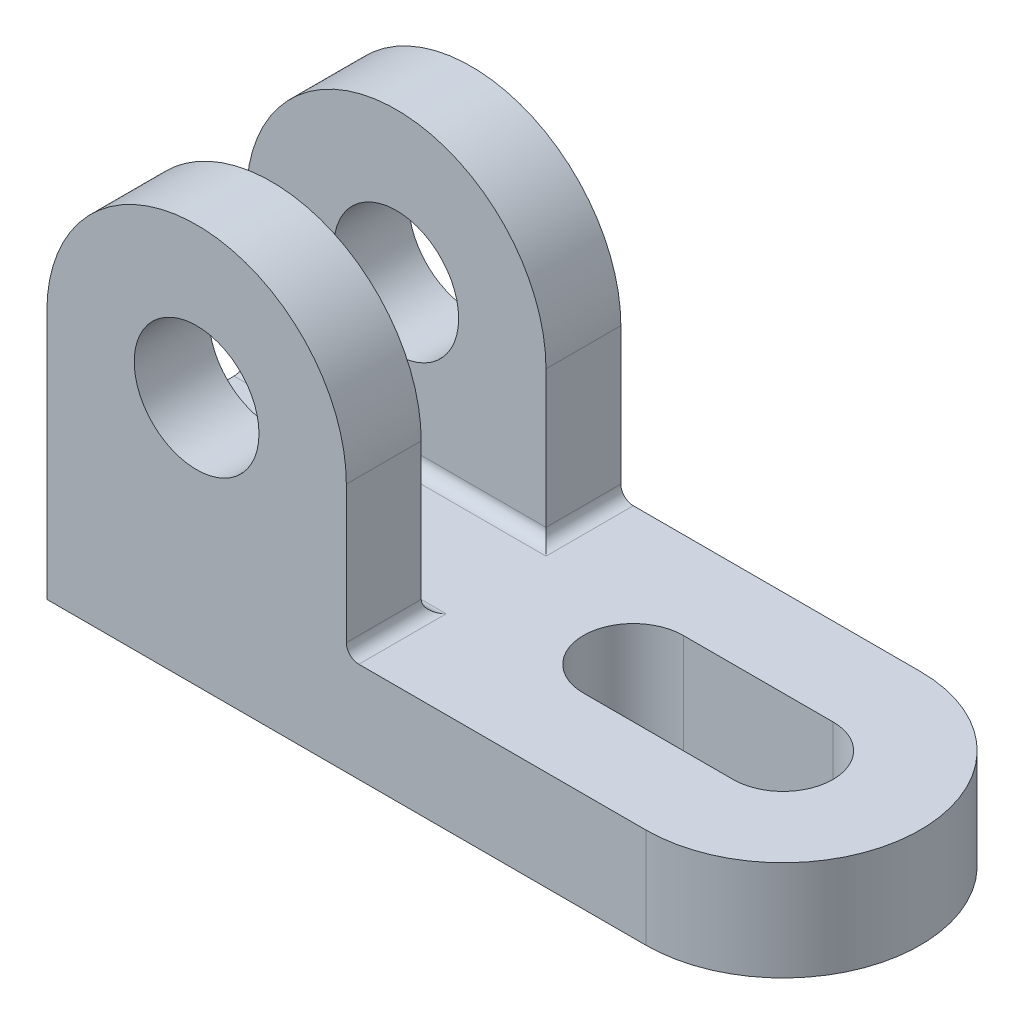
ISO-10303-21;
HEADER;
FILE_DESCRIPTION(('STEP AP214'),'2;1');
FILE_NAME('part.step','',(''),(''),'','','');
FILE_SCHEMA(('AUTOMOTIVE_DESIGN { 1 0 10303 214 1 1 1 1 }'));
ENDSEC;
DATA;
#1=APPLICATION_CONTEXT('core data for automotive mechanical design processes');
#2=APPLICATION_PROTOCOL_DEFINITION('international standard','automotive_design',2000,#1);
#3=PRODUCT_CONTEXT('',#1,'mechanical');
#4=PRODUCT('Part','Part','',(#3));
#5=PRODUCT_RELATED_PRODUCT_CATEGORY('part','',(#4));
#6=PRODUCT_DEFINITION_FORMATION('','',#4);
#7=PRODUCT_DEFINITION_CONTEXT('part definition',#1,'design');
#8=PRODUCT_DEFINITION('design','',#6,#7);
#9=PRODUCT_DEFINITION_SHAPE('','',#8);
#10=(LENGTH_UNIT() NAMED_UNIT(*) SI_UNIT(.MILLI.,.METRE.));
#11=(NAMED_UNIT(*) PLANE_ANGLE_UNIT() SI_UNIT($,.RADIAN.));
#12=(NAMED_UNIT(*) SI_UNIT($,.STERADIAN.) SOLID_ANGLE_UNIT());
#13=UNCERTAINTY_MEASURE_WITH_UNIT(LENGTH_MEASURE(1.E-05),#10,'distance_accuracy_value','');
#14=(GEOMETRIC_REPRESENTATION_CONTEXT(3) GLOBAL_UNCERTAINTY_ASSIGNED_CONTEXT((#13)) GLOBAL_UNIT_ASSIGNED_CONTEXT((#10,
#11,#12)) REPRESENTATION_CONTEXT('',''));
#15=CARTESIAN_POINT('',(0.,0.,0.));
#16=DIRECTION('',(0.,0.,1.));
#17=DIRECTION('',(1.,0.,0.));
#18=AXIS2_PLACEMENT_3D('',#15,#16,#17);
#19=CARTESIAN_POINT('',(37.,16.,0.));
#20=DIRECTION('',(0.,1.,0.));
#21=DIRECTION('',(0.,0.,1.));
#22=AXIS2_PLACEMENT_3D('',#19,#20,#21);
#23=PLANE('',#22);
#24=CARTESIAN_POINT('',(37.,16.,0.));
#25=DIRECTION('',(0.,1.,0.));
#26=DIRECTION('',(0.,0.,1.));
#27=AXIS2_PLACEMENT_3D('',#24,#25,#26);
#28=CIRCLE('',#27,8.);
#29=CARTESIAN_POINT('',(37.,16.,8.));
#30=VERTEX_POINT('',#29);
#31=CARTESIAN_POINT('',(37.,16.,-8.));
#32=VERTEX_POINT('',#31);
#33=EDGE_CURVE('E208',#30,#32,#28,.T.);
#34=ORIENTED_EDGE('',*,*,#33,.F.);
#35=DIRECTION('',(1.,0.,0.));
#36=VECTOR('',#35,1.);
#37=CARTESIAN_POINT('',(37.,16.,8.));
#38=LINE('',#37,#36);
#39=CARTESIAN_POINT('',(13.,16.,8.));
#40=VERTEX_POINT('',#39);
#41=EDGE_CURVE('E216',#40,#30,#38,.T.);
#42=ORIENTED_EDGE('',*,*,#41,.F.);
#43=CARTESIAN_POINT('',(13.,16.,0.));
#44=DIRECTION('',(0.,1.,0.));
#45=DIRECTION('',(0.,0.,1.));
#46=AXIS2_PLACEMENT_3D('',#43,#44,#45);
#47=CIRCLE('',#46,8.);
#48=CARTESIAN_POINT('',(13.,16.,-8.));
#49=VERTEX_POINT('',#48);
#50=EDGE_CURVE('E213',#49,#40,#47,.T.);
#51=ORIENTED_EDGE('',*,*,#50,.F.);
#52=DIRECTION('',(-1.,0.,0.));
#53=VECTOR('',#52,1.);
#54=CARTESIAN_POINT('',(37.,16.,-7.99999999999999));
#55=LINE('',#54,#53);
#56=EDGE_CURVE('E210',#32,#49,#55,.T.);
#57=ORIENTED_EDGE('',*,*,#56,.F.);
#58=EDGE_LOOP('',(#34,#42,#51,#57));
#59=FACE_BOUND('',#58,.T.);
#60=DIRECTION('',(0.,0.,1.));
#61=VECTOR('',#60,1.);
#62=CARTESIAN_POINT('',(-59.,16.,-22.));
#63=LINE('',#62,#61);
#64=CARTESIAN_POINT('',(-59.,16.,-8.));
#65=VERTEX_POINT('',#64);
#66=CARTESIAN_POINT('',(-59.,16.,8.));
#67=VERTEX_POINT('',#66);
#68=EDGE_CURVE('E232',#65,#67,#63,.T.);
#69=ORIENTED_EDGE('',*,*,#68,.T.);
#70=DIRECTION('',(1.,0.,0.));
#71=VECTOR('',#70,1.);
#72=CARTESIAN_POINT('',(37.,16.,8.));
#73=LINE('',#72,#71);
#74=CARTESIAN_POINT('',(-8.99999999999999,16.,8.));
#75=VERTEX_POINT('',#74);
#76=EDGE_CURVE('E267',#67,#75,#73,.T.);
#77=ORIENTED_EDGE('',*,*,#76,.T.);
#78=DIRECTION('',(0.,0.,-1.));
#79=VECTOR('',#78,1.);
#80=CARTESIAN_POINT('',(-8.99999999999999,16.,22.));
#81=LINE('',#80,#79);
#82=CARTESIAN_POINT('',(-8.99999999999999,16.,22.));
#83=VERTEX_POINT('',#82);
#84=EDGE_CURVE('E265',#75,#83,#81,.F.);
#85=ORIENTED_EDGE('',*,*,#84,.T.);
#86=DIRECTION('',(1.,0.,0.));
#87=VECTOR('',#86,1.);
#88=CARTESIAN_POINT('',(-59.,16.,22.));
#89=LINE('',#88,#87);
#90=CARTESIAN_POINT('',(37.,16.,22.));
#91=VERTEX_POINT('',#90);
#92=EDGE_CURVE('E235',#83,#91,#89,.T.);
#93=ORIENTED_EDGE('',*,*,#92,.T.);
#94=CARTESIAN_POINT('',(37.,16.,0.));
#95=DIRECTION('',(0.,1.,0.));
#96=DIRECTION('',(0.,0.,1.));
#97=AXIS2_PLACEMENT_3D('',#94,#95,#96);
#98=CIRCLE('',#97,22.);
#99=CARTESIAN_POINT('',(37.,16.,-22.));
#100=VERTEX_POINT('',#99);
#101=EDGE_CURVE('E238',#91,#100,#98,.T.);
#102=ORIENTED_EDGE('',*,*,#101,.T.);
#103=DIRECTION('',(-1.,0.,0.));
#104=VECTOR('',#103,1.);
#105=CARTESIAN_POINT('',(-59.,16.,-22.));
#106=LINE('',#105,#104);
#107=CARTESIAN_POINT('',(-8.99999999999999,16.,-22.));
#108=VERTEX_POINT('',#107);
#109=EDGE_CURVE('E240',#100,#108,#106,.T.);
#110=ORIENTED_EDGE('',*,*,#109,.T.);
#111=DIRECTION('',(0.,0.,1.));
#112=VECTOR('',#111,1.);
#113=CARTESIAN_POINT('',(-8.99999999999999,16.,0.));
#114=LINE('',#113,#112);
#115=CARTESIAN_POINT('',(-8.99999999999999,16.,-8.));
#116=VERTEX_POINT('',#115);
#117=EDGE_CURVE('E262',#108,#116,#114,.T.);
#118=ORIENTED_EDGE('',*,*,#117,.T.);
#119=DIRECTION('',(-1.,0.,0.));
#120=VECTOR('',#119,1.);
#121=CARTESIAN_POINT('',(37.,16.,-8.));
#122=LINE('',#121,#120);
#123=EDGE_CURVE('E260',#116,#65,#122,.T.);
#124=ORIENTED_EDGE('',*,*,#123,.T.);
#125=EDGE_LOOP('',(#69,#77,#85,#93,#102,#110,#118,#124));
#126=FACE_BOUND('',#125,.T.);
#127=ADVANCED_FACE('F33',(#59,#126),#23,.T.);
#128=CARTESIAN_POINT('',(-59.,16.,-22.));
#129=DIRECTION('',(1.,0.,0.));
#130=DIRECTION('',(0.,0.,-1.));
#131=AXIS2_PLACEMENT_3D('',#128,#129,#130);
#132=PLANE('',#131);
#133=DIRECTION('',(0.,0.,1.));
#134=VECTOR('',#133,1.);
#135=CARTESIAN_POINT('',(-59.,0.,-22.));
#136=LINE('',#135,#134);
#137=CARTESIAN_POINT('',(-59.,0.,-22.));
#138=VERTEX_POINT('',#137);
#139=CARTESIAN_POINT('',(-59.,0.,22.));
#140=VERTEX_POINT('',#139);
#141=EDGE_CURVE('E231',#138,#140,#136,.T.);
#142=ORIENTED_EDGE('',*,*,#141,.T.);
#143=DIRECTION('',(0.,-1.,0.));
#144=VECTOR('',#143,1.);
#145=CARTESIAN_POINT('',(-59.,16.,22.));
#146=LINE('',#145,#144);
#147=CARTESIAN_POINT('',(-59.,40.,22.));
#148=VERTEX_POINT('',#147);
#149=EDGE_CURVE('E257',#148,#140,#146,.T.);
#150=ORIENTED_EDGE('',*,*,#149,.F.);
#151=DIRECTION('',(0.,0.,1.));
#152=VECTOR('',#151,1.);
#153=CARTESIAN_POINT('',(-59.,40.,10.));
#154=LINE('',#153,#152);
#155=CARTESIAN_POINT('',(-59.,40.,10.));
#156=VERTEX_POINT('',#155);
#157=EDGE_CURVE('E195',#156,#148,#154,.T.);
#158=ORIENTED_EDGE('',*,*,#157,.F.);
#159=DIRECTION('',(0.,1.,0.));
#160=VECTOR('',#159,1.);
#161=CARTESIAN_POINT('',(-59.,0.,10.));
#162=LINE('',#161,#160);
#163=CARTESIAN_POINT('',(-59.,18.,10.));
#164=VERTEX_POINT('',#163);
#165=EDGE_CURVE('E186',#164,#156,#162,.T.);
#166=ORIENTED_EDGE('',*,*,#165,.F.);
#167=CARTESIAN_POINT('',(-59.,18.,8.));
#168=DIRECTION('',(1.,0.,0.));
#169=DIRECTION('',(0.,0.,-1.));
#170=AXIS2_PLACEMENT_3D('',#167,#168,#169);
#171=CIRCLE('',#170,2.);
#172=EDGE_CURVE('E277',#164,#67,#171,.T.);
#173=ORIENTED_EDGE('',*,*,#172,.T.);
#174=ORIENTED_EDGE('',*,*,#68,.F.);
#175=CARTESIAN_POINT('',(-59.,18.,-8.));
#176=DIRECTION('',(1.,0.,0.));
#177=DIRECTION('',(0.,0.,-1.));
#178=AXIS2_PLACEMENT_3D('',#175,#176,#177);
#179=CIRCLE('',#178,2.);
#180=CARTESIAN_POINT('',(-59.,18.,-10.));
#181=VERTEX_POINT('',#180);
#182=EDGE_CURVE('E11',#65,#181,#179,.T.);
#183=ORIENTED_EDGE('',*,*,#182,.T.);
#184=DIRECTION('',(0.,1.,0.));
#185=VECTOR('',#184,1.);
#186=CARTESIAN_POINT('',(-59.,0.,-10.));
#187=LINE('',#186,#185);
#188=CARTESIAN_POINT('',(-59.,40.,-10.));
#189=VERTEX_POINT('',#188);
#190=EDGE_CURVE('E151',#181,#189,#187,.T.);
#191=ORIENTED_EDGE('',*,*,#190,.T.);
#192=DIRECTION('',(0.,0.,-1.));
#193=VECTOR('',#192,1.);
#194=CARTESIAN_POINT('',(-59.,40.,-10.));
#195=LINE('',#194,#193);
#196=CARTESIAN_POINT('',(-59.,40.,-22.));
#197=VERTEX_POINT('',#196);
#198=EDGE_CURVE('E156',#189,#197,#195,.T.);
#199=ORIENTED_EDGE('',*,*,#198,.T.);
#200=DIRECTION('',(0.,-1.,0.));
#201=VECTOR('',#200,1.);
#202=CARTESIAN_POINT('',(-59.,16.,-22.));
#203=LINE('',#202,#201);
#204=EDGE_CURVE('E243',#197,#138,#203,.T.);
#205=ORIENTED_EDGE('',*,*,#204,.T.);
#206=EDGE_LOOP('',(#142,#150,#158,#166,#173,#174,#183,#191,#199,#205));
#207=FACE_BOUND('',#206,.T.);
#208=ADVANCED_FACE('F153',(#207),#132,.F.);
#209=CARTESIAN_POINT('',(-59.,16.,22.));
#210=DIRECTION('',(0.,0.,-1.));
#211=DIRECTION('',(-1.,0.,0.));
#212=AXIS2_PLACEMENT_3D('',#209,#210,#211);
#213=PLANE('',#212);
#214=ORIENTED_EDGE('',*,*,#92,.F.);
#215=CARTESIAN_POINT('',(-8.99999999999999,18.,22.));
#216=DIRECTION('',(0.,0.,-1.));
#217=DIRECTION('',(-1.,0.,0.));
#218=AXIS2_PLACEMENT_3D('',#215,#216,#217);
#219=CIRCLE('',#218,2.);
#220=CARTESIAN_POINT('',(-11.,18.,22.));
#221=VERTEX_POINT('',#220);
#222=EDGE_CURVE('E279',#83,#221,#219,.T.);
#223=ORIENTED_EDGE('',*,*,#222,.T.);
#224=DIRECTION('',(0.,1.,0.));
#225=VECTOR('',#224,1.);
#226=CARTESIAN_POINT('',(-11.,0.,22.));
#227=LINE('',#226,#225);
#228=CARTESIAN_POINT('',(-11.,40.,22.));
#229=VERTEX_POINT('',#228);
#230=EDGE_CURVE('E191',#221,#229,#227,.T.);
#231=ORIENTED_EDGE('',*,*,#230,.T.);
#232=CARTESIAN_POINT('',(-35.,40.,22.));
#233=DIRECTION('',(0.,0.,1.));
#234=DIRECTION('',(1.,0.,0.));
#235=AXIS2_PLACEMENT_3D('',#232,#233,#234);
#236=CIRCLE('',#235,24.);
#237=EDGE_CURVE('E181',#229,#148,#236,.T.);
#238=ORIENTED_EDGE('',*,*,#237,.T.);
#239=ORIENTED_EDGE('',*,*,#149,.T.);
#240=DIRECTION('',(1.,0.,0.));
#241=VECTOR('',#240,1.);
#242=CARTESIAN_POINT('',(-59.,0.,22.));
#243=LINE('',#242,#241);
#244=CARTESIAN_POINT('',(37.,0.,22.));
#245=VERTEX_POINT('',#244);
#246=EDGE_CURVE('E245',#140,#245,#243,.T.);
#247=ORIENTED_EDGE('',*,*,#246,.T.);
#248=DIRECTION('',(0.,-1.,0.));
#249=VECTOR('',#248,1.);
#250=CARTESIAN_POINT('',(37.,16.,22.));
#251=LINE('',#250,#249);
#252=EDGE_CURVE('E254',#91,#245,#251,.T.);
#253=ORIENTED_EDGE('',*,*,#252,.F.);
#254=EDGE_LOOP('',(#214,#223,#231,#238,#239,#247,#253));
#255=FACE_BOUND('',#254,.T.);
#256=CARTESIAN_POINT('',(-35.,40.,22.));
#257=DIRECTION('',(0.,0.,1.));
#258=DIRECTION('',(1.,0.,0.));
#259=AXIS2_PLACEMENT_3D('',#256,#257,#258);
#260=CIRCLE('',#259,10.);
#261=CARTESIAN_POINT('',(-25.,40.,22.));
#262=VERTEX_POINT('',#261);
#263=EDGE_CURVE('E173',#262,#262,#260,.T.);
#264=ORIENTED_EDGE('',*,*,#263,.F.);
#265=EDGE_LOOP('',(#264));
#266=FACE_BOUND('',#265,.T.);
#267=ADVANCED_FACE('F336',(#255,#266),#213,.F.);
#268=CARTESIAN_POINT('',(37.,16.,0.));
#269=DIRECTION('',(0.,-1.,0.));
#270=DIRECTION('',(0.,0.,-1.));
#271=AXIS2_PLACEMENT_3D('',#268,#269,#270);
#272=CYLINDRICAL_SURFACE('',#271,22.);
#273=CARTESIAN_POINT('',(37.,0.,0.));
#274=DIRECTION('',(0.,1.,0.));
#275=DIRECTION('',(0.,0.,1.));
#276=AXIS2_PLACEMENT_3D('',#273,#274,#275);
#277=CIRCLE('',#276,22.);
#278=CARTESIAN_POINT('',(37.,0.,-22.));
#279=VERTEX_POINT('',#278);
#280=EDGE_CURVE('E247',#245,#279,#277,.T.);
#281=ORIENTED_EDGE('',*,*,#280,.T.);
#282=DIRECTION('',(0.,-1.,0.));
#283=VECTOR('',#282,1.);
#284=CARTESIAN_POINT('',(37.,16.,-22.));
#285=LINE('',#284,#283);
#286=EDGE_CURVE('E251',#100,#279,#285,.T.);
#287=ORIENTED_EDGE('',*,*,#286,.F.);
#288=ORIENTED_EDGE('',*,*,#101,.F.);
#289=ORIENTED_EDGE('',*,*,#252,.T.);
#290=EDGE_LOOP('',(#281,#287,#288,#289));
#291=FACE_BOUND('',#290,.T.);
#292=ADVANCED_FACE('F349',(#291),#272,.T.);
#293=CARTESIAN_POINT('',(-59.,16.,-22.));
#294=DIRECTION('',(0.,0.,1.));
#295=DIRECTION('',(1.,0.,0.));
#296=AXIS2_PLACEMENT_3D('',#293,#294,#295);
#297=PLANE('',#296);
#298=ORIENTED_EDGE('',*,*,#204,.F.);
#299=CARTESIAN_POINT('',(-35.,40.,-22.));
#300=DIRECTION('',(0.,0.,1.));
#301=DIRECTION('',(1.,0.,0.));
#302=AXIS2_PLACEMENT_3D('',#299,#300,#301);
#303=CIRCLE('',#302,24.);
#304=CARTESIAN_POINT('',(-11.,40.,-22.));
#305=VERTEX_POINT('',#304);
#306=EDGE_CURVE('E170',#305,#197,#303,.T.);
#307=ORIENTED_EDGE('',*,*,#306,.F.);
#308=DIRECTION('',(0.,1.,0.));
#309=VECTOR('',#308,1.);
#310=CARTESIAN_POINT('',(-11.,0.,-22.));
#311=LINE('',#310,#309);
#312=CARTESIAN_POINT('',(-11.,18.,-22.));
#313=VERTEX_POINT('',#312);
#314=EDGE_CURVE('E289',#313,#305,#311,.T.);
#315=ORIENTED_EDGE('',*,*,#314,.F.);
#316=CARTESIAN_POINT('',(-8.99999999999999,18.,-22.));
#317=DIRECTION('',(0.,0.,1.));
#318=DIRECTION('',(1.,0.,0.));
#319=AXIS2_PLACEMENT_3D('',#316,#317,#318);
#320=CIRCLE('',#319,2.);
#321=EDGE_CURVE('E42',#313,#108,#320,.T.);
#322=ORIENTED_EDGE('',*,*,#321,.T.);
#323=ORIENTED_EDGE('',*,*,#109,.F.);
#324=ORIENTED_EDGE('',*,*,#286,.T.);
#325=DIRECTION('',(-1.,0.,0.));
#326=VECTOR('',#325,1.);
#327=CARTESIAN_POINT('',(-59.,0.,-22.));
#328=LINE('',#327,#326);
#329=EDGE_CURVE('E236',#279,#138,#328,.T.);
#330=ORIENTED_EDGE('',*,*,#329,.T.);
#331=EDGE_LOOP('',(#298,#307,#315,#322,#323,#324,#330));
#332=FACE_BOUND('',#331,.T.);
#333=CARTESIAN_POINT('',(-35.,40.,-22.));
#334=DIRECTION('',(0.,0.,1.));
#335=DIRECTION('',(1.,0.,0.));
#336=AXIS2_PLACEMENT_3D('',#333,#334,#335);
#337=CIRCLE('',#336,10.);
#338=CARTESIAN_POINT('',(-25.,40.,-22.));
#339=VERTEX_POINT('',#338);
#340=EDGE_CURVE('E282',#339,#339,#337,.T.);
#341=ORIENTED_EDGE('',*,*,#340,.T.);
#342=EDGE_LOOP('',(#341));
#343=FACE_BOUND('',#342,.T.);
#344=ADVANCED_FACE('F304',(#332,#343),#297,.F.);
#345=CARTESIAN_POINT('',(37.,0.,0.));
#346=DIRECTION('',(0.,1.,0.));
#347=DIRECTION('',(0.,0.,1.));
#348=AXIS2_PLACEMENT_3D('',#345,#346,#347);
#349=PLANE('',#348);
#350=ORIENTED_EDGE('',*,*,#141,.F.);
#351=ORIENTED_EDGE('',*,*,#329,.F.);
#352=ORIENTED_EDGE('',*,*,#280,.F.);
#353=ORIENTED_EDGE('',*,*,#246,.F.);
#354=EDGE_LOOP('',(#350,#351,#352,#353));
#355=FACE_BOUND('',#354,.T.);
#356=DIRECTION('',(-1.,0.,0.));
#357=VECTOR('',#356,1.);
#358=CARTESIAN_POINT('',(37.,0.,8.));
#359=LINE('',#358,#357);
#360=CARTESIAN_POINT('',(37.,0.,8.));
#361=VERTEX_POINT('',#360);
#362=CARTESIAN_POINT('',(13.,0.,8.));
#363=VERTEX_POINT('',#362);
#364=EDGE_CURVE('E202',#361,#363,#359,.T.);
#365=ORIENTED_EDGE('',*,*,#364,.F.);
#366=CARTESIAN_POINT('',(37.,0.,0.));
#367=DIRECTION('',(0.,1.,0.));
#368=DIRECTION('',(0.,0.,1.));
#369=AXIS2_PLACEMENT_3D('',#366,#367,#368);
#370=CIRCLE('',#369,8.);
#371=CARTESIAN_POINT('',(37.,0.,-7.99999999999999));
#372=VERTEX_POINT('',#371);
#373=EDGE_CURVE('E205',#372,#361,#370,.F.);
#374=ORIENTED_EDGE('',*,*,#373,.F.);
#375=DIRECTION('',(1.,0.,0.));
#376=VECTOR('',#375,1.);
#377=CARTESIAN_POINT('',(37.,0.,-7.99999999999999));
#378=LINE('',#377,#376);
#379=CARTESIAN_POINT('',(13.,0.,-8.));
#380=VERTEX_POINT('',#379);
#381=EDGE_CURVE('E222',#380,#372,#378,.T.);
#382=ORIENTED_EDGE('',*,*,#381,.F.);
#383=CARTESIAN_POINT('',(13.,0.,0.));
#384=DIRECTION('',(0.,1.,0.));
#385=DIRECTION('',(0.,0.,1.));
#386=AXIS2_PLACEMENT_3D('',#383,#384,#385);
#387=CIRCLE('',#386,8.);
#388=EDGE_CURVE('E198',#363,#380,#387,.F.);
#389=ORIENTED_EDGE('',*,*,#388,.F.);
#390=EDGE_LOOP('',(#365,#374,#382,#389));
#391=FACE_BOUND('',#390,.T.);
#392=ADVANCED_FACE('F343',(#355,#391),#349,.F.);
#393=CARTESIAN_POINT('',(37.,-0.001000000000001,0.));
#394=DIRECTION('',(0.,1.,0.));
#395=DIRECTION('',(0.,0.,1.));
#396=AXIS2_PLACEMENT_3D('',#393,#394,#395);
#397=CYLINDRICAL_SURFACE('',#396,8.);
#398=ORIENTED_EDGE('',*,*,#373,.T.);
#399=DIRECTION('',(0.,1.,0.));
#400=VECTOR('',#399,1.);
#401=CARTESIAN_POINT('',(37.,-0.001000000000001,8.));
#402=LINE('',#401,#400);
#403=EDGE_CURVE('E220',#361,#30,#402,.T.);
#404=ORIENTED_EDGE('',*,*,#403,.T.);
#405=ORIENTED_EDGE('',*,*,#33,.T.);
#406=DIRECTION('',(0.,1.,0.));
#407=VECTOR('',#406,1.);
#408=CARTESIAN_POINT('',(37.,-0.001000000000001,-7.99999999999999));
#409=LINE('',#408,#407);
#410=EDGE_CURVE('E219',#372,#32,#409,.T.);
#411=ORIENTED_EDGE('',*,*,#410,.F.);
#412=EDGE_LOOP('',(#398,#404,#405,#411));
#413=FACE_BOUND('',#412,.T.);
#414=ADVANCED_FACE('F341',(#413),#397,.F.);
#415=CARTESIAN_POINT('',(37.,-0.001000000000001,8.));
#416=DIRECTION('',(0.,0.,1.));
#417=DIRECTION('',(1.,0.,0.));
#418=AXIS2_PLACEMENT_3D('',#415,#416,#417);
#419=PLANE('',#418);
#420=ORIENTED_EDGE('',*,*,#364,.T.);
#421=DIRECTION('',(0.,1.,0.));
#422=VECTOR('',#421,1.);
#423=CARTESIAN_POINT('',(13.,-0.001000000000001,8.));
#424=LINE('',#423,#422);
#425=EDGE_CURVE('E223',#363,#40,#424,.T.);
#426=ORIENTED_EDGE('',*,*,#425,.T.);
#427=ORIENTED_EDGE('',*,*,#41,.T.);
#428=ORIENTED_EDGE('',*,*,#403,.F.);
#429=EDGE_LOOP('',(#420,#426,#427,#428));
#430=FACE_BOUND('',#429,.T.);
#431=ADVANCED_FACE('F496',(#430),#419,.F.);
#432=CARTESIAN_POINT('',(13.,-0.001000000000001,0.));
#433=DIRECTION('',(0.,1.,0.));
#434=DIRECTION('',(0.,0.,1.));
#435=AXIS2_PLACEMENT_3D('',#432,#433,#434);
#436=CYLINDRICAL_SURFACE('',#435,8.);
#437=ORIENTED_EDGE('',*,*,#388,.T.);
#438=DIRECTION('',(0.,1.,0.));
#439=VECTOR('',#438,1.);
#440=CARTESIAN_POINT('',(13.,-0.001000000000001,-8.));
#441=LINE('',#440,#439);
#442=EDGE_CURVE('E225',#380,#49,#441,.T.);
#443=ORIENTED_EDGE('',*,*,#442,.T.);
#444=ORIENTED_EDGE('',*,*,#50,.T.);
#445=ORIENTED_EDGE('',*,*,#425,.F.);
#446=EDGE_LOOP('',(#437,#443,#444,#445));
#447=FACE_BOUND('',#446,.T.);
#448=ADVANCED_FACE('F486',(#447),#436,.F.);
#449=CARTESIAN_POINT('',(37.,-0.001000000000001,-7.99999999999999));
#450=DIRECTION('',(0.,0.,-1.));
#451=DIRECTION('',(-1.,0.,0.));
#452=AXIS2_PLACEMENT_3D('',#449,#450,#451);
#453=PLANE('',#452);
#454=ORIENTED_EDGE('',*,*,#381,.T.);
#455=ORIENTED_EDGE('',*,*,#410,.T.);
#456=ORIENTED_EDGE('',*,*,#56,.T.);
#457=ORIENTED_EDGE('',*,*,#442,.F.);
#458=EDGE_LOOP('',(#454,#455,#456,#457));
#459=FACE_BOUND('',#458,.T.);
#460=ADVANCED_FACE('F413',(#459),#453,.F.);
#461=CARTESIAN_POINT('',(-11.,0.,10.));
#462=DIRECTION('',(1.,0.,0.));
#463=DIRECTION('',(0.,0.,-1.));
#464=AXIS2_PLACEMENT_3D('',#461,#462,#463);
#465=PLANE('',#464);
#466=ORIENTED_EDGE('',*,*,#230,.F.);
#467=DIRECTION('',(0.,0.,-1.));
#468=VECTOR('',#467,1.);
#469=CARTESIAN_POINT('',(-11.,18.,10.));
#470=LINE('',#469,#468);
#471=CARTESIAN_POINT('',(-11.,18.,10.));
#472=VERTEX_POINT('',#471);
#473=EDGE_CURVE('E272',#221,#472,#470,.T.);
#474=ORIENTED_EDGE('',*,*,#473,.T.);
#475=DIRECTION('',(0.,1.,0.));
#476=VECTOR('',#475,1.);
#477=CARTESIAN_POINT('',(-11.,0.,10.));
#478=LINE('',#477,#476);
#479=CARTESIAN_POINT('',(-11.,40.,10.));
#480=VERTEX_POINT('',#479);
#481=EDGE_CURVE('E180',#472,#480,#478,.T.);
#482=ORIENTED_EDGE('',*,*,#481,.T.);
#483=DIRECTION('',(0.,0.,1.));
#484=VECTOR('',#483,1.);
#485=CARTESIAN_POINT('',(-11.,40.,10.));
#486=LINE('',#485,#484);
#487=EDGE_CURVE('E188',#480,#229,#486,.T.);
#488=ORIENTED_EDGE('',*,*,#487,.T.);
#489=EDGE_LOOP('',(#466,#474,#482,#488));
#490=FACE_BOUND('',#489,.T.);
#491=ADVANCED_FACE('F407',(#490),#465,.T.);
#492=CARTESIAN_POINT('',(-35.,40.,10.));
#493=DIRECTION('',(0.,0.,1.));
#494=DIRECTION('',(1.,0.,0.));
#495=AXIS2_PLACEMENT_3D('',#492,#493,#494);
#496=CYLINDRICAL_SURFACE('',#495,10.);
#497=CARTESIAN_POINT('',(-35.,40.,10.));
#498=DIRECTION('',(0.,0.,1.));
#499=DIRECTION('',(1.,0.,0.));
#500=AXIS2_PLACEMENT_3D('',#497,#498,#499);
#501=CIRCLE('',#500,10.);
#502=CARTESIAN_POINT('',(-25.,40.,10.));
#503=VERTEX_POINT('',#502);
#504=EDGE_CURVE('E177',#503,#503,#501,.T.);
#505=ORIENTED_EDGE('',*,*,#504,.F.);
#506=EDGE_LOOP('',(#505));
#507=FACE_BOUND('',#506,.T.);
#508=ORIENTED_EDGE('',*,*,#263,.T.);
#509=EDGE_LOOP('',(#508));
#510=FACE_BOUND('',#509,.T.);
#511=ADVANCED_FACE('F412',(#507,#510),#496,.F.);
#512=CARTESIAN_POINT('',(-35.,40.,10.));
#513=DIRECTION('',(0.,0.,1.));
#514=DIRECTION('',(1.,0.,0.));
#515=AXIS2_PLACEMENT_3D('',#512,#513,#514);
#516=CYLINDRICAL_SURFACE('',#515,24.);
#517=ORIENTED_EDGE('',*,*,#237,.F.);
#518=ORIENTED_EDGE('',*,*,#487,.F.);
#519=CARTESIAN_POINT('',(-35.,40.,10.));
#520=DIRECTION('',(0.,0.,1.));
#521=DIRECTION('',(1.,0.,0.));
#522=AXIS2_PLACEMENT_3D('',#519,#520,#521);
#523=CIRCLE('',#522,24.);
#524=EDGE_CURVE('E183',#480,#156,#523,.T.);
#525=ORIENTED_EDGE('',*,*,#524,.T.);
#526=ORIENTED_EDGE('',*,*,#157,.T.);
#527=EDGE_LOOP('',(#517,#518,#525,#526));
#528=FACE_BOUND('',#527,.T.);
#529=ADVANCED_FACE('F398',(#528),#516,.T.);
#530=CARTESIAN_POINT('',(0.,0.,10.));
#531=DIRECTION('',(0.,0.,1.));
#532=DIRECTION('',(1.,0.,0.));
#533=AXIS2_PLACEMENT_3D('',#530,#531,#532);
#534=PLANE('',#533);
#535=ORIENTED_EDGE('',*,*,#481,.F.);
#536=DIRECTION('',(1.,0.,0.));
#537=VECTOR('',#536,1.);
#538=CARTESIAN_POINT('',(0.,18.,10.));
#539=LINE('',#538,#537);
#540=EDGE_CURVE('E270',#472,#164,#539,.F.);
#541=ORIENTED_EDGE('',*,*,#540,.T.);
#542=ORIENTED_EDGE('',*,*,#165,.T.);
#543=ORIENTED_EDGE('',*,*,#524,.F.);
#544=EDGE_LOOP('',(#535,#541,#542,#543));
#545=FACE_BOUND('',#544,.T.);
#546=ORIENTED_EDGE('',*,*,#504,.T.);
#547=EDGE_LOOP('',(#546));
#548=FACE_BOUND('',#547,.T.);
#549=ADVANCED_FACE('F386',(#545,#548),#534,.F.);
#550=CARTESIAN_POINT('',(-11.,0.,-10.));
#551=DIRECTION('',(-1.,0.,0.));
#552=DIRECTION('',(0.,0.,1.));
#553=AXIS2_PLACEMENT_3D('',#550,#551,#552);
#554=PLANE('',#553);
#555=DIRECTION('',(0.,1.,0.));
#556=VECTOR('',#555,1.);
#557=CARTESIAN_POINT('',(-11.,0.,-10.));
#558=LINE('',#557,#556);
#559=CARTESIAN_POINT('',(-11.,18.,-10.));
#560=VERTEX_POINT('',#559);
#561=CARTESIAN_POINT('',(-11.,40.,-10.));
#562=VERTEX_POINT('',#561);
#563=EDGE_CURVE('E159',#560,#562,#558,.T.);
#564=ORIENTED_EDGE('',*,*,#563,.F.);
#565=DIRECTION('',(0.,0.,1.));
#566=VECTOR('',#565,1.);
#567=CARTESIAN_POINT('',(-11.,18.,-10.));
#568=LINE('',#567,#566);
#569=EDGE_CURVE('E274',#560,#313,#568,.F.);
#570=ORIENTED_EDGE('',*,*,#569,.T.);
#571=ORIENTED_EDGE('',*,*,#314,.T.);
#572=DIRECTION('',(0.,0.,-1.));
#573=VECTOR('',#572,1.);
#574=CARTESIAN_POINT('',(-11.,40.,-10.));
#575=LINE('',#574,#573);
#576=EDGE_CURVE('E171',#562,#305,#575,.T.);
#577=ORIENTED_EDGE('',*,*,#576,.F.);
#578=EDGE_LOOP('',(#564,#570,#571,#577));
#579=FACE_BOUND('',#578,.T.);
#580=ADVANCED_FACE('F381',(#579),#554,.F.);
#581=CARTESIAN_POINT('',(-35.,40.,-10.));
#582=DIRECTION('',(0.,0.,-1.));
#583=DIRECTION('',(-1.,0.,0.));
#584=AXIS2_PLACEMENT_3D('',#581,#582,#583);
#585=CYLINDRICAL_SURFACE('',#584,24.);
#586=ORIENTED_EDGE('',*,*,#306,.T.);
#587=ORIENTED_EDGE('',*,*,#198,.F.);
#588=CARTESIAN_POINT('',(-35.,40.,-10.));
#589=DIRECTION('',(0.,0.,1.));
#590=DIRECTION('',(1.,0.,0.));
#591=AXIS2_PLACEMENT_3D('',#588,#589,#590);
#592=CIRCLE('',#591,24.);
#593=EDGE_CURVE('E158',#562,#189,#592,.T.);
#594=ORIENTED_EDGE('',*,*,#593,.F.);
#595=ORIENTED_EDGE('',*,*,#576,.T.);
#596=EDGE_LOOP('',(#586,#587,#594,#595));
#597=FACE_BOUND('',#596,.T.);
#598=ADVANCED_FACE('F168',(#597),#585,.T.);
#599=CARTESIAN_POINT('',(-35.,40.,-10.));
#600=DIRECTION('',(0.,0.,-1.));
#601=DIRECTION('',(-1.,0.,0.));
#602=AXIS2_PLACEMENT_3D('',#599,#600,#601);
#603=CYLINDRICAL_SURFACE('',#602,10.);
#604=CARTESIAN_POINT('',(-35.,40.,-10.));
#605=DIRECTION('',(0.,0.,1.));
#606=DIRECTION('',(1.,0.,0.));
#607=AXIS2_PLACEMENT_3D('',#604,#605,#606);
#608=CIRCLE('',#607,10.);
#609=CARTESIAN_POINT('',(-25.,40.,-10.));
#610=VERTEX_POINT('',#609);
#611=EDGE_CURVE('E310',#610,#610,#608,.T.);
#612=ORIENTED_EDGE('',*,*,#611,.T.);
#613=EDGE_LOOP('',(#612));
#614=FACE_BOUND('',#613,.T.);
#615=ORIENTED_EDGE('',*,*,#340,.F.);
#616=EDGE_LOOP('',(#615));
#617=FACE_BOUND('',#616,.T.);
#618=ADVANCED_FACE('F316',(#614,#617),#603,.F.);
#619=CARTESIAN_POINT('',(0.,0.,-10.));
#620=DIRECTION('',(0.,0.,-1.));
#621=DIRECTION('',(1.,0.,0.));
#622=AXIS2_PLACEMENT_3D('',#619,#620,#621);
#623=PLANE('',#622);
#624=ORIENTED_EDGE('',*,*,#190,.F.);
#625=DIRECTION('',(-1.,0.,0.));
#626=VECTOR('',#625,1.);
#627=CARTESIAN_POINT('',(0.,18.,-10.));
#628=LINE('',#627,#626);
#629=EDGE_CURVE('E55',#181,#560,#628,.F.);
#630=ORIENTED_EDGE('',*,*,#629,.T.);
#631=ORIENTED_EDGE('',*,*,#563,.T.);
#632=ORIENTED_EDGE('',*,*,#593,.T.);
#633=EDGE_LOOP('',(#624,#630,#631,#632));
#634=FACE_BOUND('',#633,.T.);
#635=ORIENTED_EDGE('',*,*,#611,.F.);
#636=EDGE_LOOP('',(#635));
#637=FACE_BOUND('',#636,.T.);
#638=ADVANCED_FACE('F162',(#634,#637),#623,.F.);
#639=CARTESIAN_POINT('',(-8.99999999999999,18.,10.));
#640=DIRECTION('',(0.,0.,1.));
#641=DIRECTION('',(1.,0.,0.));
#642=AXIS2_PLACEMENT_3D('',#639,#640,#641);
#643=CYLINDRICAL_SURFACE('',#642,2.);
#644=ORIENTED_EDGE('',*,*,#222,.F.);
#645=ORIENTED_EDGE('',*,*,#84,.F.);
#646=CARTESIAN_POINT('',(-8.99999999999999,18.,8.));
#647=DIRECTION('',(0.707106781186547,0.,0.707106781186547));
#648=DIRECTION('',(-0.707106781186547,0.,0.707106781186547));
#649=AXIS2_PLACEMENT_3D('',#646,#647,#648);
#650=ELLIPSE('',#649,2.82842712474619,2.);
#651=EDGE_CURVE('E281',#472,#75,#650,.T.);
#652=ORIENTED_EDGE('',*,*,#651,.F.);
#653=ORIENTED_EDGE('',*,*,#473,.F.);
#654=EDGE_LOOP('',(#644,#645,#652,#653));
#655=FACE_BOUND('',#654,.T.);
#656=ADVANCED_FACE('F319',(#655),#643,.F.);
#657=CARTESIAN_POINT('',(37.,18.,8.));
#658=DIRECTION('',(1.,0.,0.));
#659=DIRECTION('',(0.,0.,-1.));
#660=AXIS2_PLACEMENT_3D('',#657,#658,#659);
#661=CYLINDRICAL_SURFACE('',#660,2.);
#662=ORIENTED_EDGE('',*,*,#172,.F.);
#663=ORIENTED_EDGE('',*,*,#540,.F.);
#664=ORIENTED_EDGE('',*,*,#651,.T.);
#665=ORIENTED_EDGE('',*,*,#76,.F.);
#666=EDGE_LOOP('',(#662,#663,#664,#665));
#667=FACE_BOUND('',#666,.T.);
#668=ADVANCED_FACE('F325',(#667),#661,.F.);
#669=CARTESIAN_POINT('',(37.,18.,-8.));
#670=DIRECTION('',(-1.,0.,0.));
#671=DIRECTION('',(0.,0.,1.));
#672=AXIS2_PLACEMENT_3D('',#669,#670,#671);
#673=CYLINDRICAL_SURFACE('',#672,2.);
#674=ORIENTED_EDGE('',*,*,#182,.F.);
#675=ORIENTED_EDGE('',*,*,#123,.F.);
#676=CARTESIAN_POINT('',(-8.99999999999999,18.,-8.));
#677=DIRECTION('',(-0.707106781186547,0.,0.707106781186547));
#678=DIRECTION('',(-0.707106781186547,0.,-0.707106781186547));
#679=AXIS2_PLACEMENT_3D('',#676,#677,#678);
#680=ELLIPSE('',#679,2.82842712474619,2.);
#681=EDGE_CURVE('E37',#560,#116,#680,.T.);
#682=ORIENTED_EDGE('',*,*,#681,.F.);
#683=ORIENTED_EDGE('',*,*,#629,.F.);
#684=EDGE_LOOP('',(#674,#675,#682,#683));
#685=FACE_BOUND('',#684,.T.);
#686=ADVANCED_FACE('F35',(#685),#673,.F.);
#687=CARTESIAN_POINT('',(-8.99999999999999,18.,0.));
#688=DIRECTION('',(0.,0.,1.));
#689=DIRECTION('',(1.,0.,0.));
#690=AXIS2_PLACEMENT_3D('',#687,#688,#689);
#691=CYLINDRICAL_SURFACE('',#690,2.);
#692=ORIENTED_EDGE('',*,*,#321,.F.);
#693=ORIENTED_EDGE('',*,*,#569,.F.);
#694=ORIENTED_EDGE('',*,*,#681,.T.);
#695=ORIENTED_EDGE('',*,*,#117,.F.);
#696=EDGE_LOOP('',(#692,#693,#694,#695));
#697=FACE_BOUND('',#696,.T.);
#698=ADVANCED_FACE('F297',(#697),#691,.F.);
#699=CLOSED_SHELL('',(#127,#208,#267,#292,#344,#392,#414,#431,#448,#460,#491,#511,#529,#549,
#580,#598,#618,#638,#656,#668,#686,#698));
#700=MANIFOLD_SOLID_BREP('B2',#699);
#701=ADVANCED_BREP_SHAPE_REPRESENTATION('',(#18,#700),#14);
#702=SHAPE_DEFINITION_REPRESENTATION(#9,#701);
ENDSEC;
END-ISO-10303-21;
